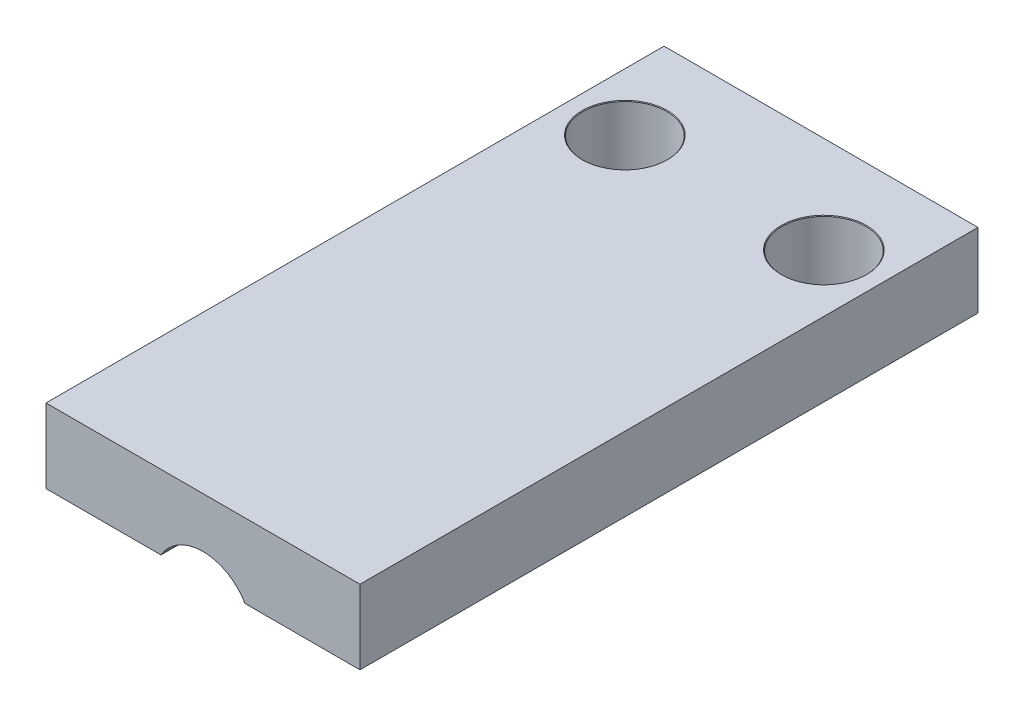
ISO-10303-21;
HEADER;
FILE_DESCRIPTION(('STEP AP214'),'2;1');
FILE_NAME('part.step','',(''),(''),'','','');
FILE_SCHEMA(('AUTOMOTIVE_DESIGN { 1 0 10303 214 1 1 1 1 }'));
ENDSEC;
DATA;
#1=APPLICATION_CONTEXT('core data for automotive mechanical design processes');
#2=APPLICATION_PROTOCOL_DEFINITION('international standard','automotive_design',2000,#1);
#3=PRODUCT_CONTEXT('',#1,'mechanical');
#4=PRODUCT('Part','Part','',(#3));
#5=PRODUCT_RELATED_PRODUCT_CATEGORY('part','',(#4));
#6=PRODUCT_DEFINITION_FORMATION('','',#4);
#7=PRODUCT_DEFINITION_CONTEXT('part definition',#1,'design');
#8=PRODUCT_DEFINITION('design','',#6,#7);
#9=PRODUCT_DEFINITION_SHAPE('','',#8);
#10=(LENGTH_UNIT() NAMED_UNIT(*) SI_UNIT(.MILLI.,.METRE.));
#11=(NAMED_UNIT(*) PLANE_ANGLE_UNIT() SI_UNIT($,.RADIAN.));
#12=(NAMED_UNIT(*) SI_UNIT($,.STERADIAN.) SOLID_ANGLE_UNIT());
#13=UNCERTAINTY_MEASURE_WITH_UNIT(LENGTH_MEASURE(1.E-05),#10,'distance_accuracy_value','');
#14=(GEOMETRIC_REPRESENTATION_CONTEXT(3) GLOBAL_UNCERTAINTY_ASSIGNED_CONTEXT((#13)) GLOBAL_UNIT_ASSIGNED_CONTEXT((#10,
#11,#12)) REPRESENTATION_CONTEXT('',''));
#15=CARTESIAN_POINT('',(0.,0.,0.));
#16=DIRECTION('',(0.,0.,1.));
#17=DIRECTION('',(1.,0.,0.));
#18=AXIS2_PLACEMENT_3D('',#15,#16,#17);
#19=CARTESIAN_POINT('',(0.,0.,0.));
#20=DIRECTION('',(0.,1.,0.));
#21=DIRECTION('',(0.,0.,1.));
#22=AXIS2_PLACEMENT_3D('',#19,#20,#21);
#23=PLANE('',#22);
#24=DIRECTION('',(0.,0.,-1.));
#25=VECTOR('',#24,1.);
#26=CARTESIAN_POINT('',(-1.7,0.,79.0011081386104));
#27=LINE('',#26,#25);
#28=CARTESIAN_POINT('',(-1.7,0.,12.5));
#29=VERTEX_POINT('',#28);
#30=CARTESIAN_POINT('',(-1.7,0.,-4.68));
#31=VERTEX_POINT('',#30);
#32=EDGE_CURVE('E59',#29,#31,#27,.T.);
#33=ORIENTED_EDGE('',*,*,#32,.F.);
#34=DIRECTION('',(1.,0.,0.));
#35=VECTOR('',#34,1.);
#36=CARTESIAN_POINT('',(-6.35,0.,12.5));
#37=LINE('',#36,#35);
#38=CARTESIAN_POINT('',(-6.35,0.,12.5));
#39=VERTEX_POINT('',#38);
#40=EDGE_CURVE('E118',#39,#29,#37,.T.);
#41=ORIENTED_EDGE('',*,*,#40,.F.);
#42=DIRECTION('',(0.,0.,1.));
#43=VECTOR('',#42,1.);
#44=CARTESIAN_POINT('',(-6.35,0.,-12.5));
#45=LINE('',#44,#43);
#46=CARTESIAN_POINT('',(-6.35,0.,-12.5));
#47=VERTEX_POINT('',#46);
#48=EDGE_CURVE('E132',#47,#39,#45,.T.);
#49=ORIENTED_EDGE('',*,*,#48,.F.);
#50=DIRECTION('',(-1.,0.,0.));
#51=VECTOR('',#50,1.);
#52=CARTESIAN_POINT('',(-6.35,0.,-12.5));
#53=LINE('',#52,#51);
#54=CARTESIAN_POINT('',(6.35,0.,-12.5));
#55=VERTEX_POINT('',#54);
#56=EDGE_CURVE('E147',#55,#47,#53,.T.);
#57=ORIENTED_EDGE('',*,*,#56,.F.);
#58=DIRECTION('',(0.,0.,-1.));
#59=VECTOR('',#58,1.);
#60=CARTESIAN_POINT('',(6.35,0.,-12.5));
#61=LINE('',#60,#59);
#62=CARTESIAN_POINT('',(6.35,0.,12.5));
#63=VERTEX_POINT('',#62);
#64=EDGE_CURVE('E120',#63,#55,#61,.T.);
#65=ORIENTED_EDGE('',*,*,#64,.F.);
#66=CARTESIAN_POINT('',(1.7,0.,12.5));
#67=VERTEX_POINT('',#66);
#68=EDGE_CURVE('E89',#67,#63,#37,.T.);
#69=ORIENTED_EDGE('',*,*,#68,.F.);
#70=DIRECTION('',(0.,0.,-1.));
#71=VECTOR('',#70,1.);
#72=CARTESIAN_POINT('',(1.7,0.,79.0011081386104));
#73=LINE('',#72,#71);
#74=CARTESIAN_POINT('',(1.7,0.,-4.67999999999999));
#75=VERTEX_POINT('',#74);
#76=EDGE_CURVE('E107',#67,#75,#73,.T.);
#77=ORIENTED_EDGE('',*,*,#76,.T.);
#78=DIRECTION('',(1.,0.,0.));
#79=VECTOR('',#78,1.);
#80=CARTESIAN_POINT('',(-6.35,0.,-4.68));
#81=LINE('',#80,#79);
#82=EDGE_CURVE('E111',#31,#75,#81,.T.);
#83=ORIENTED_EDGE('',*,*,#82,.F.);
#84=EDGE_LOOP('',(#33,#41,#49,#57,#65,#69,#77,#83));
#85=FACE_BOUND('',#84,.T.);
#86=CARTESIAN_POINT('',(4.025,0.,-8.59));
#87=DIRECTION('',(0.,1.,0.));
#88=DIRECTION('',(0.,0.,1.));
#89=AXIS2_PLACEMENT_3D('',#86,#87,#88);
#90=CIRCLE('',#89,1.7);
#91=CARTESIAN_POINT('',(4.025,0.,-6.89));
#92=VERTEX_POINT('',#91);
#93=EDGE_CURVE('E161',#92,#92,#90,.F.);
#94=ORIENTED_EDGE('',*,*,#93,.F.);
#95=EDGE_LOOP('',(#94));
#96=FACE_BOUND('',#95,.T.);
#97=CARTESIAN_POINT('',(-4.025,0.,-8.59));
#98=DIRECTION('',(0.,1.,0.));
#99=DIRECTION('',(0.,0.,1.));
#100=AXIS2_PLACEMENT_3D('',#97,#98,#99);
#101=CIRCLE('',#100,1.7);
#102=CARTESIAN_POINT('',(-4.025,0.,-6.89));
#103=VERTEX_POINT('',#102);
#104=EDGE_CURVE('E175',#103,#103,#101,.F.);
#105=ORIENTED_EDGE('',*,*,#104,.F.);
#106=EDGE_LOOP('',(#105));
#107=FACE_BOUND('',#106,.T.);
#108=ADVANCED_FACE('F43',(#85,#96,#107),#23,.F.);
#109=CARTESIAN_POINT('',(-6.35,3.,12.5));
#110=DIRECTION('',(0.,0.,-1.));
#111=DIRECTION('',(-1.,0.,0.));
#112=AXIS2_PLACEMENT_3D('',#109,#110,#111);
#113=PLANE('',#112);
#114=CARTESIAN_POINT('',(0.,-1.,12.5));
#115=DIRECTION('',(0.,0.,-1.));
#116=DIRECTION('',(-1.,0.,0.));
#117=AXIS2_PLACEMENT_3D('',#114,#115,#116);
#118=CIRCLE('',#117,1.9723082923316);
#119=EDGE_CURVE('E104',#67,#29,#118,.F.);
#120=ORIENTED_EDGE('',*,*,#119,.F.);
#121=ORIENTED_EDGE('',*,*,#68,.T.);
#122=DIRECTION('',(0.,-1.,0.));
#123=VECTOR('',#122,1.);
#124=CARTESIAN_POINT('',(6.35,3.,12.5));
#125=LINE('',#124,#123);
#126=CARTESIAN_POINT('',(6.35,3.,12.5));
#127=VERTEX_POINT('',#126);
#128=EDGE_CURVE('E136',#127,#63,#125,.T.);
#129=ORIENTED_EDGE('',*,*,#128,.F.);
#130=DIRECTION('',(1.,0.,0.));
#131=VECTOR('',#130,1.);
#132=CARTESIAN_POINT('',(-6.35,3.,12.5));
#133=LINE('',#132,#131);
#134=CARTESIAN_POINT('',(-6.35,3.,12.5));
#135=VERTEX_POINT('',#134);
#136=EDGE_CURVE('E68',#135,#127,#133,.T.);
#137=ORIENTED_EDGE('',*,*,#136,.F.);
#138=DIRECTION('',(0.,-1.,0.));
#139=VECTOR('',#138,1.);
#140=CARTESIAN_POINT('',(-6.35,3.,12.5));
#141=LINE('',#140,#139);
#142=EDGE_CURVE('E125',#135,#39,#141,.T.);
#143=ORIENTED_EDGE('',*,*,#142,.T.);
#144=ORIENTED_EDGE('',*,*,#40,.T.);
#145=EDGE_LOOP('',(#120,#121,#129,#137,#143,#144));
#146=FACE_BOUND('',#145,.T.);
#147=ADVANCED_FACE('F123',(#146),#113,.F.);
#148=CARTESIAN_POINT('',(6.35,3.,-12.5));
#149=DIRECTION('',(-1.,0.,0.));
#150=DIRECTION('',(0.,0.,1.));
#151=AXIS2_PLACEMENT_3D('',#148,#149,#150);
#152=PLANE('',#151);
#153=ORIENTED_EDGE('',*,*,#64,.T.);
#154=DIRECTION('',(0.,-1.,0.));
#155=VECTOR('',#154,1.);
#156=CARTESIAN_POINT('',(6.35,3.,-12.5));
#157=LINE('',#156,#155);
#158=CARTESIAN_POINT('',(6.35,3.,-12.5));
#159=VERTEX_POINT('',#158);
#160=EDGE_CURVE('E11',#159,#55,#157,.T.);
#161=ORIENTED_EDGE('',*,*,#160,.F.);
#162=DIRECTION('',(0.,0.,-1.));
#163=VECTOR('',#162,1.);
#164=CARTESIAN_POINT('',(6.35,3.,-12.5));
#165=LINE('',#164,#163);
#166=EDGE_CURVE('E127',#127,#159,#165,.T.);
#167=ORIENTED_EDGE('',*,*,#166,.F.);
#168=ORIENTED_EDGE('',*,*,#128,.T.);
#169=EDGE_LOOP('',(#153,#161,#167,#168));
#170=FACE_BOUND('',#169,.T.);
#171=ADVANCED_FACE('F45',(#170),#152,.F.);
#172=CARTESIAN_POINT('',(-6.35,3.,-12.5));
#173=DIRECTION('',(0.,0.,1.));
#174=DIRECTION('',(1.,0.,0.));
#175=AXIS2_PLACEMENT_3D('',#172,#173,#174);
#176=PLANE('',#175);
#177=ORIENTED_EDGE('',*,*,#56,.T.);
#178=DIRECTION('',(0.,-1.,0.));
#179=VECTOR('',#178,1.);
#180=CARTESIAN_POINT('',(-6.35,3.,-12.5));
#181=LINE('',#180,#179);
#182=CARTESIAN_POINT('',(-6.35,3.,-12.5));
#183=VERTEX_POINT('',#182);
#184=EDGE_CURVE('E52',#183,#47,#181,.T.);
#185=ORIENTED_EDGE('',*,*,#184,.F.);
#186=DIRECTION('',(-1.,0.,0.));
#187=VECTOR('',#186,1.);
#188=CARTESIAN_POINT('',(-6.35,3.,-12.5));
#189=LINE('',#188,#187);
#190=EDGE_CURVE('E96',#159,#183,#189,.T.);
#191=ORIENTED_EDGE('',*,*,#190,.F.);
#192=ORIENTED_EDGE('',*,*,#160,.T.);
#193=EDGE_LOOP('',(#177,#185,#191,#192));
#194=FACE_BOUND('',#193,.T.);
#195=ADVANCED_FACE('F205',(#194),#176,.F.);
#196=CARTESIAN_POINT('',(-6.35,3.,-12.5));
#197=DIRECTION('',(1.,0.,0.));
#198=DIRECTION('',(0.,0.,-1.));
#199=AXIS2_PLACEMENT_3D('',#196,#197,#198);
#200=PLANE('',#199);
#201=ORIENTED_EDGE('',*,*,#48,.T.);
#202=ORIENTED_EDGE('',*,*,#142,.F.);
#203=DIRECTION('',(0.,0.,1.));
#204=VECTOR('',#203,1.);
#205=CARTESIAN_POINT('',(-6.35,3.,-12.5));
#206=LINE('',#205,#204);
#207=EDGE_CURVE('E145',#183,#135,#206,.T.);
#208=ORIENTED_EDGE('',*,*,#207,.F.);
#209=ORIENTED_EDGE('',*,*,#184,.T.);
#210=EDGE_LOOP('',(#201,#202,#208,#209));
#211=FACE_BOUND('',#210,.T.);
#212=ADVANCED_FACE('F144',(#211),#200,.F.);
#213=CARTESIAN_POINT('',(0.,3.,0.));
#214=DIRECTION('',(0.,1.,0.));
#215=DIRECTION('',(0.,0.,1.));
#216=AXIS2_PLACEMENT_3D('',#213,#214,#215);
#217=PLANE('',#216);
#218=CARTESIAN_POINT('',(-4.025,3.,-8.59));
#219=DIRECTION('',(0.,1.,0.));
#220=DIRECTION('',(0.,0.,1.));
#221=AXIS2_PLACEMENT_3D('',#218,#219,#220);
#222=CIRCLE('',#221,1.725);
#223=CARTESIAN_POINT('',(-4.025,3.,-6.865));
#224=VERTEX_POINT('',#223);
#225=EDGE_CURVE('E183',#224,#224,#222,.T.);
#226=ORIENTED_EDGE('',*,*,#225,.F.);
#227=EDGE_LOOP('',(#226));
#228=FACE_BOUND('',#227,.T.);
#229=CARTESIAN_POINT('',(4.025,3.,-8.59));
#230=DIRECTION('',(0.,1.,0.));
#231=DIRECTION('',(0.,0.,1.));
#232=AXIS2_PLACEMENT_3D('',#229,#230,#231);
#233=CIRCLE('',#232,1.725);
#234=CARTESIAN_POINT('',(4.025,3.,-6.865));
#235=VERTEX_POINT('',#234);
#236=EDGE_CURVE('E171',#235,#235,#233,.T.);
#237=ORIENTED_EDGE('',*,*,#236,.F.);
#238=EDGE_LOOP('',(#237));
#239=FACE_BOUND('',#238,.T.);
#240=ORIENTED_EDGE('',*,*,#166,.T.);
#241=ORIENTED_EDGE('',*,*,#190,.T.);
#242=ORIENTED_EDGE('',*,*,#207,.T.);
#243=ORIENTED_EDGE('',*,*,#136,.T.);
#244=EDGE_LOOP('',(#240,#241,#242,#243));
#245=FACE_BOUND('',#244,.T.);
#246=ADVANCED_FACE('F201',(#228,#239,#245),#217,.T.);
#247=CARTESIAN_POINT('',(0.,-1.,79.0011081386104));
#248=DIRECTION('',(0.,0.,-1.));
#249=DIRECTION('',(-1.,0.,0.));
#250=AXIS2_PLACEMENT_3D('',#247,#248,#249);
#251=CYLINDRICAL_SURFACE('',#250,1.9723082923316);
#252=ORIENTED_EDGE('',*,*,#119,.T.);
#253=ORIENTED_EDGE('',*,*,#32,.T.);
#254=CARTESIAN_POINT('',(0.,-1.,-4.67999999999999));
#255=DIRECTION('',(0.,0.,-1.));
#256=DIRECTION('',(-1.,0.,0.));
#257=AXIS2_PLACEMENT_3D('',#254,#255,#256);
#258=CIRCLE('',#257,1.9723082923316);
#259=EDGE_CURVE('E110',#75,#31,#258,.F.);
#260=ORIENTED_EDGE('',*,*,#259,.F.);
#261=ORIENTED_EDGE('',*,*,#76,.F.);
#262=EDGE_LOOP('',(#252,#253,#260,#261));
#263=FACE_BOUND('',#262,.T.);
#264=ADVANCED_FACE('F105',(#263),#251,.F.);
#265=CARTESIAN_POINT('',(-6.35,3.,-4.68));
#266=DIRECTION('',(0.,0.,-1.));
#267=DIRECTION('',(-1.,0.,0.));
#268=AXIS2_PLACEMENT_3D('',#265,#266,#267);
#269=PLANE('',#268);
#270=ORIENTED_EDGE('',*,*,#259,.T.);
#271=ORIENTED_EDGE('',*,*,#82,.T.);
#272=EDGE_LOOP('',(#270,#271));
#273=FACE_BOUND('',#272,.T.);
#274=ADVANCED_FACE('F220',(#273),#269,.F.);
#275=CARTESIAN_POINT('',(4.025,3.,-8.59));
#276=DIRECTION('',(0.,1.,0.));
#277=DIRECTION('',(0.,0.,1.));
#278=AXIS2_PLACEMENT_3D('',#275,#276,#277);
#279=CYLINDRICAL_SURFACE('',#278,1.7);
#280=ORIENTED_EDGE('',*,*,#93,.T.);
#281=EDGE_LOOP('',(#280));
#282=FACE_BOUND('',#281,.T.);
#283=CARTESIAN_POINT('',(4.025,2.975,-8.59));
#284=DIRECTION('',(0.,1.,0.));
#285=DIRECTION('',(0.,0.,1.));
#286=AXIS2_PLACEMENT_3D('',#283,#284,#285);
#287=CIRCLE('',#286,1.7);
#288=CARTESIAN_POINT('',(4.025,2.975,-6.89));
#289=VERTEX_POINT('',#288);
#290=EDGE_CURVE('E167',#289,#289,#287,.T.);
#291=ORIENTED_EDGE('',*,*,#290,.T.);
#292=EDGE_LOOP('',(#291));
#293=FACE_BOUND('',#292,.T.);
#294=ADVANCED_FACE('F228',(#282,#293),#279,.F.);
#295=CARTESIAN_POINT('',(4.025,3.,-8.59));
#296=DIRECTION('',(0.,1.,0.));
#297=DIRECTION('',(0.,0.,1.));
#298=AXIS2_PLACEMENT_3D('',#295,#296,#297);
#299=CONICAL_SURFACE('',#298,1.725,0.785398163397414);
#300=ORIENTED_EDGE('',*,*,#290,.F.);
#301=EDGE_LOOP('',(#300));
#302=FACE_BOUND('',#301,.T.);
#303=ORIENTED_EDGE('',*,*,#236,.T.);
#304=EDGE_LOOP('',(#303));
#305=FACE_BOUND('',#304,.T.);
#306=ADVANCED_FACE('F226',(#302,#305),#299,.F.);
#307=CARTESIAN_POINT('',(-4.025,3.,-8.59));
#308=DIRECTION('',(0.,1.,0.));
#309=DIRECTION('',(0.,0.,1.));
#310=AXIS2_PLACEMENT_3D('',#307,#308,#309);
#311=CYLINDRICAL_SURFACE('',#310,1.7);
#312=ORIENTED_EDGE('',*,*,#104,.T.);
#313=EDGE_LOOP('',(#312));
#314=FACE_BOUND('',#313,.T.);
#315=CARTESIAN_POINT('',(-4.025,2.975,-8.59));
#316=DIRECTION('',(0.,1.,0.));
#317=DIRECTION('',(0.,0.,1.));
#318=AXIS2_PLACEMENT_3D('',#315,#316,#317);
#319=CIRCLE('',#318,1.7);
#320=CARTESIAN_POINT('',(-4.025,2.975,-6.89));
#321=VERTEX_POINT('',#320);
#322=EDGE_CURVE('E179',#321,#321,#319,.T.);
#323=ORIENTED_EDGE('',*,*,#322,.T.);
#324=EDGE_LOOP('',(#323));
#325=FACE_BOUND('',#324,.T.);
#326=ADVANCED_FACE('F191',(#314,#325),#311,.F.);
#327=CARTESIAN_POINT('',(-4.025,3.,-8.59));
#328=DIRECTION('',(0.,1.,0.));
#329=DIRECTION('',(0.,0.,1.));
#330=AXIS2_PLACEMENT_3D('',#327,#328,#329);
#331=CONICAL_SURFACE('',#330,1.725,0.785398163397414);
#332=ORIENTED_EDGE('',*,*,#322,.F.);
#333=EDGE_LOOP('',(#332));
#334=FACE_BOUND('',#333,.T.);
#335=ORIENTED_EDGE('',*,*,#225,.T.);
#336=EDGE_LOOP('',(#335));
#337=FACE_BOUND('',#336,.T.);
#338=ADVANCED_FACE('F235',(#334,#337),#331,.F.);
#339=CLOSED_SHELL('',(#108,#147,#171,#195,#212,#246,#264,#274,#294,#306,#326,#338));
#340=MANIFOLD_SOLID_BREP('B2',#339);
#341=ADVANCED_BREP_SHAPE_REPRESENTATION('',(#18,#340),#14);
#342=SHAPE_DEFINITION_REPRESENTATION(#9,#341);
ENDSEC;
END-ISO-10303-21;
